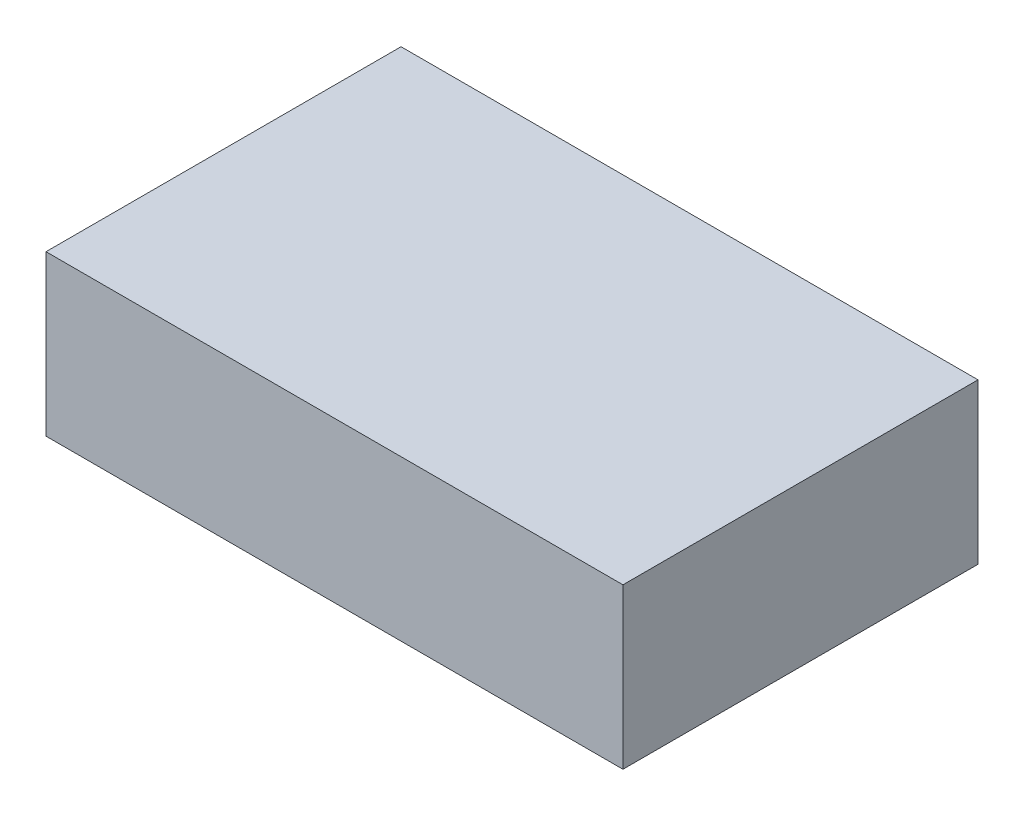
ISO-10303-21;
HEADER;
FILE_DESCRIPTION(('STEP AP214'),'2;1');
FILE_NAME('part.step','',(''),(''),'','','');
FILE_SCHEMA(('AUTOMOTIVE_DESIGN { 1 0 10303 214 1 1 1 1 }'));
ENDSEC;
DATA;
#1=APPLICATION_CONTEXT('core data for automotive mechanical design processes');
#2=APPLICATION_PROTOCOL_DEFINITION('international standard','automotive_design',2000,#1);
#3=PRODUCT_CONTEXT('',#1,'mechanical');
#4=PRODUCT('Part','Part','',(#3));
#5=PRODUCT_RELATED_PRODUCT_CATEGORY('part','',(#4));
#6=PRODUCT_DEFINITION_FORMATION('','',#4);
#7=PRODUCT_DEFINITION_CONTEXT('part definition',#1,'design');
#8=PRODUCT_DEFINITION('design','',#6,#7);
#9=PRODUCT_DEFINITION_SHAPE('','',#8);
#10=(LENGTH_UNIT() NAMED_UNIT(*) SI_UNIT(.MILLI.,.METRE.));
#11=(NAMED_UNIT(*) PLANE_ANGLE_UNIT() SI_UNIT($,.RADIAN.));
#12=(NAMED_UNIT(*) SI_UNIT($,.STERADIAN.) SOLID_ANGLE_UNIT());
#13=UNCERTAINTY_MEASURE_WITH_UNIT(LENGTH_MEASURE(1.E-05),#10,'distance_accuracy_value','');
#14=(GEOMETRIC_REPRESENTATION_CONTEXT(3) GLOBAL_UNCERTAINTY_ASSIGNED_CONTEXT((#13)) GLOBAL_UNIT_ASSIGNED_CONTEXT((#10,
#11,#12)) REPRESENTATION_CONTEXT('',''));
#15=CARTESIAN_POINT('',(0.,0.,0.));
#16=DIRECTION('',(0.,0.,1.));
#17=DIRECTION('',(1.,0.,0.));
#18=AXIS2_PLACEMENT_3D('',#15,#16,#17);
#19=CARTESIAN_POINT('',(0.,22.86,0.));
#20=DIRECTION('',(1.,0.,0.));
#21=DIRECTION('',(0.,0.,-1.));
#22=AXIS2_PLACEMENT_3D('',#19,#20,#21);
#23=PLANE('',#22);
#24=DIRECTION('',(0.,0.,1.));
#25=VECTOR('',#24,1.);
#26=CARTESIAN_POINT('',(0.,0.,0.));
#27=LINE('',#26,#25);
#28=CARTESIAN_POINT('',(0.,0.,-50.8));
#29=VERTEX_POINT('',#28);
#30=CARTESIAN_POINT('',(0.,0.,0.));
#31=VERTEX_POINT('',#30);
#32=EDGE_CURVE('E107',#29,#31,#27,.T.);
#33=ORIENTED_EDGE('',*,*,#32,.T.);
#34=DIRECTION('',(0.,-1.,0.));
#35=VECTOR('',#34,1.);
#36=CARTESIAN_POINT('',(0.,22.86,0.));
#37=LINE('',#36,#35);
#38=CARTESIAN_POINT('',(0.,22.86,0.));
#39=VERTEX_POINT('',#38);
#40=EDGE_CURVE('E11',#39,#31,#37,.T.);
#41=ORIENTED_EDGE('',*,*,#40,.F.);
#42=DIRECTION('',(0.,0.,1.));
#43=VECTOR('',#42,1.);
#44=CARTESIAN_POINT('',(0.,22.86,0.));
#45=LINE('',#44,#43);
#46=CARTESIAN_POINT('',(0.,22.86,-50.8));
#47=VERTEX_POINT('',#46);
#48=EDGE_CURVE('E91',#47,#39,#45,.T.);
#49=ORIENTED_EDGE('',*,*,#48,.F.);
#50=DIRECTION('',(0.,-1.,0.));
#51=VECTOR('',#50,1.);
#52=CARTESIAN_POINT('',(0.,22.86,-50.8));
#53=LINE('',#52,#51);
#54=EDGE_CURVE('E103',#47,#29,#53,.T.);
#55=ORIENTED_EDGE('',*,*,#54,.T.);
#56=EDGE_LOOP('',(#33,#41,#49,#55));
#57=FACE_BOUND('',#56,.T.);
#58=ADVANCED_FACE('F39',(#57),#23,.F.);
#59=CARTESIAN_POINT('',(0.,22.86,0.));
#60=DIRECTION('',(0.,0.,-1.));
#61=DIRECTION('',(-1.,0.,0.));
#62=AXIS2_PLACEMENT_3D('',#59,#60,#61);
#63=PLANE('',#62);
#64=DIRECTION('',(1.,0.,0.));
#65=VECTOR('',#64,1.);
#66=CARTESIAN_POINT('',(0.,0.,0.));
#67=LINE('',#66,#65);
#68=CARTESIAN_POINT('',(82.55,0.,0.));
#69=VERTEX_POINT('',#68);
#70=EDGE_CURVE('E96',#31,#69,#67,.T.);
#71=ORIENTED_EDGE('',*,*,#70,.T.);
#72=DIRECTION('',(0.,-1.,0.));
#73=VECTOR('',#72,1.);
#74=CARTESIAN_POINT('',(82.55,22.86,0.));
#75=LINE('',#74,#73);
#76=CARTESIAN_POINT('',(82.55,22.86,0.));
#77=VERTEX_POINT('',#76);
#78=EDGE_CURVE('E48',#77,#69,#75,.T.);
#79=ORIENTED_EDGE('',*,*,#78,.F.);
#80=DIRECTION('',(1.,0.,0.));
#81=VECTOR('',#80,1.);
#82=CARTESIAN_POINT('',(0.,22.86,0.));
#83=LINE('',#82,#81);
#84=EDGE_CURVE('E86',#39,#77,#83,.T.);
#85=ORIENTED_EDGE('',*,*,#84,.F.);
#86=ORIENTED_EDGE('',*,*,#40,.T.);
#87=EDGE_LOOP('',(#71,#79,#85,#86));
#88=FACE_BOUND('',#87,.T.);
#89=ADVANCED_FACE('F95',(#88),#63,.F.);
#90=CARTESIAN_POINT('',(82.55,22.86,0.));
#91=DIRECTION('',(-1.,0.,0.));
#92=DIRECTION('',(0.,0.,1.));
#93=AXIS2_PLACEMENT_3D('',#90,#91,#92);
#94=PLANE('',#93);
#95=DIRECTION('',(0.,0.,-1.));
#96=VECTOR('',#95,1.);
#97=CARTESIAN_POINT('',(82.55,0.,0.));
#98=LINE('',#97,#96);
#99=CARTESIAN_POINT('',(82.55,0.,-50.8));
#100=VERTEX_POINT('',#99);
#101=EDGE_CURVE('E73',#69,#100,#98,.T.);
#102=ORIENTED_EDGE('',*,*,#101,.T.);
#103=DIRECTION('',(0.,-1.,0.));
#104=VECTOR('',#103,1.);
#105=CARTESIAN_POINT('',(82.55,22.86,-50.8));
#106=LINE('',#105,#104);
#107=CARTESIAN_POINT('',(82.55,22.86,-50.8));
#108=VERTEX_POINT('',#107);
#109=EDGE_CURVE('E98',#108,#100,#106,.T.);
#110=ORIENTED_EDGE('',*,*,#109,.F.);
#111=DIRECTION('',(0.,0.,-1.));
#112=VECTOR('',#111,1.);
#113=CARTESIAN_POINT('',(82.55,22.86,0.));
#114=LINE('',#113,#112);
#115=EDGE_CURVE('E89',#77,#108,#114,.T.);
#116=ORIENTED_EDGE('',*,*,#115,.F.);
#117=ORIENTED_EDGE('',*,*,#78,.T.);
#118=EDGE_LOOP('',(#102,#110,#116,#117));
#119=FACE_BOUND('',#118,.T.);
#120=ADVANCED_FACE('F99',(#119),#94,.F.);
#121=CARTESIAN_POINT('',(0.,22.86,-50.8));
#122=DIRECTION('',(0.,0.,1.));
#123=DIRECTION('',(1.,0.,0.));
#124=AXIS2_PLACEMENT_3D('',#121,#122,#123);
#125=PLANE('',#124);
#126=DIRECTION('',(-1.,0.,0.));
#127=VECTOR('',#126,1.);
#128=CARTESIAN_POINT('',(0.,0.,-50.8));
#129=LINE('',#128,#127);
#130=EDGE_CURVE('E79',#100,#29,#129,.T.);
#131=ORIENTED_EDGE('',*,*,#130,.T.);
#132=ORIENTED_EDGE('',*,*,#54,.F.);
#133=DIRECTION('',(-1.,0.,0.));
#134=VECTOR('',#133,1.);
#135=CARTESIAN_POINT('',(0.,22.86,-50.8));
#136=LINE('',#135,#134);
#137=EDGE_CURVE('E56',#108,#47,#136,.T.);
#138=ORIENTED_EDGE('',*,*,#137,.F.);
#139=ORIENTED_EDGE('',*,*,#109,.T.);
#140=EDGE_LOOP('',(#131,#132,#138,#139));
#141=FACE_BOUND('',#140,.T.);
#142=ADVANCED_FACE('F120',(#141),#125,.F.);
#143=CARTESIAN_POINT('',(0.,22.86,0.));
#144=DIRECTION('',(0.,-1.,0.));
#145=DIRECTION('',(0.,0.,-1.));
#146=AXIS2_PLACEMENT_3D('',#143,#144,#145);
#147=PLANE('',#146);
#148=ORIENTED_EDGE('',*,*,#48,.T.);
#149=ORIENTED_EDGE('',*,*,#84,.T.);
#150=ORIENTED_EDGE('',*,*,#115,.T.);
#151=ORIENTED_EDGE('',*,*,#137,.T.);
#152=EDGE_LOOP('',(#148,#149,#150,#151));
#153=FACE_BOUND('',#152,.T.);
#154=ADVANCED_FACE('F87',(#153),#147,.F.);
#155=CARTESIAN_POINT('',(0.,0.,0.));
#156=DIRECTION('',(0.,-1.,0.));
#157=DIRECTION('',(0.,0.,-1.));
#158=AXIS2_PLACEMENT_3D('',#155,#156,#157);
#159=PLANE('',#158);
#160=ORIENTED_EDGE('',*,*,#32,.F.);
#161=ORIENTED_EDGE('',*,*,#130,.F.);
#162=ORIENTED_EDGE('',*,*,#101,.F.);
#163=ORIENTED_EDGE('',*,*,#70,.F.);
#164=EDGE_LOOP('',(#160,#161,#162,#163));
#165=FACE_BOUND('',#164,.T.);
#166=ADVANCED_FACE('F123',(#165),#159,.T.);
#167=CLOSED_SHELL('',(#58,#89,#120,#142,#154,#166));
#168=MANIFOLD_SOLID_BREP('B2',#167);
#169=ADVANCED_BREP_SHAPE_REPRESENTATION('',(#18,#168),#14);
#170=SHAPE_DEFINITION_REPRESENTATION(#9,#169);
ENDSEC;
END-ISO-10303-21;
